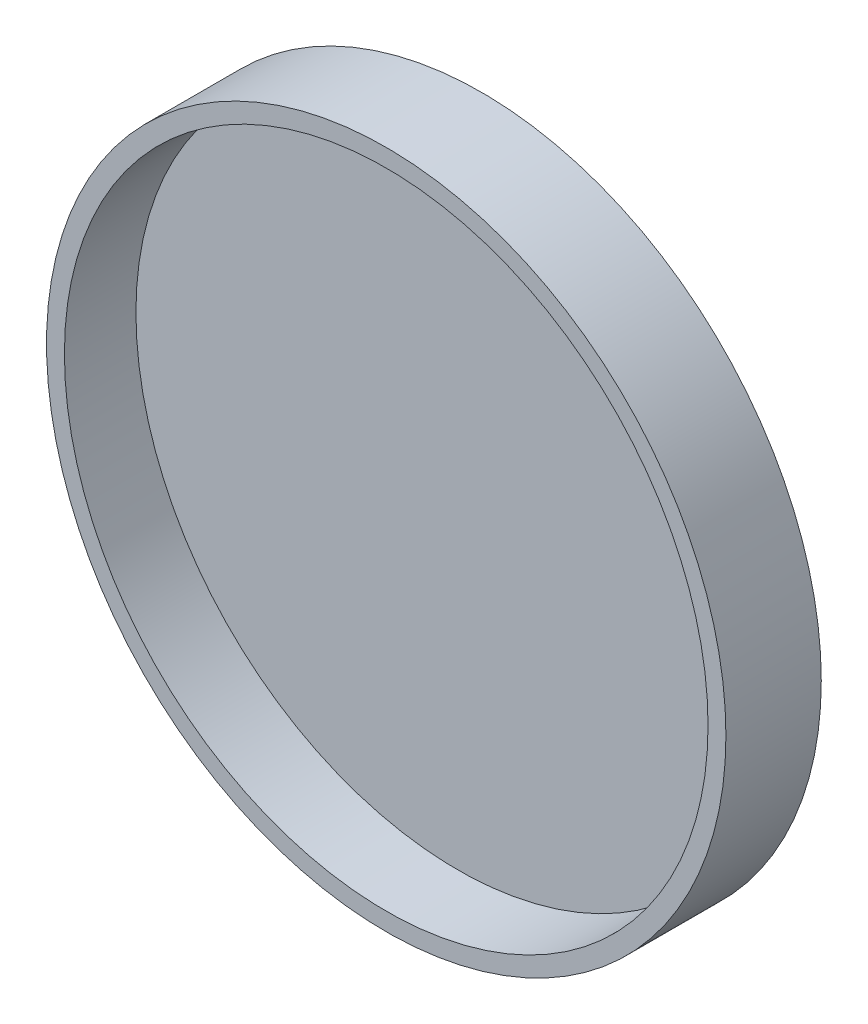
ISO-10303-21;
HEADER;
FILE_DESCRIPTION(('STEP AP214'),'2;1');
FILE_NAME('part.step','',(''),(''),'','','');
FILE_SCHEMA(('AUTOMOTIVE_DESIGN { 1 0 10303 214 1 1 1 1 }'));
ENDSEC;
DATA;
#1=APPLICATION_CONTEXT('core data for automotive mechanical design processes');
#2=APPLICATION_PROTOCOL_DEFINITION('international standard','automotive_design',2000,#1);
#3=PRODUCT_CONTEXT('',#1,'mechanical');
#4=PRODUCT('Part','Part','',(#3));
#5=PRODUCT_RELATED_PRODUCT_CATEGORY('part','',(#4));
#6=PRODUCT_DEFINITION_FORMATION('','',#4);
#7=PRODUCT_DEFINITION_CONTEXT('part definition',#1,'design');
#8=PRODUCT_DEFINITION('design','',#6,#7);
#9=PRODUCT_DEFINITION_SHAPE('','',#8);
#10=(LENGTH_UNIT() NAMED_UNIT(*) SI_UNIT(.MILLI.,.METRE.));
#11=(NAMED_UNIT(*) PLANE_ANGLE_UNIT() SI_UNIT($,.RADIAN.));
#12=(NAMED_UNIT(*) SI_UNIT($,.STERADIAN.) SOLID_ANGLE_UNIT());
#13=UNCERTAINTY_MEASURE_WITH_UNIT(LENGTH_MEASURE(1.E-05),#10,'distance_accuracy_value','');
#14=(GEOMETRIC_REPRESENTATION_CONTEXT(3) GLOBAL_UNCERTAINTY_ASSIGNED_CONTEXT((#13)) GLOBAL_UNIT_ASSIGNED_CONTEXT((#10,
#11,#12)) REPRESENTATION_CONTEXT('',''));
#15=CARTESIAN_POINT('',(0.,0.,0.));
#16=DIRECTION('',(0.,0.,1.));
#17=DIRECTION('',(1.,0.,0.));
#18=AXIS2_PLACEMENT_3D('',#15,#16,#17);
#19=CARTESIAN_POINT('',(0.,0.,0.5));
#20=DIRECTION('',(0.,0.,-1.));
#21=DIRECTION('',(-1.,0.,0.));
#22=AXIS2_PLACEMENT_3D('',#19,#20,#21);
#23=CYLINDRICAL_SURFACE('',#22,6.5);
#24=CARTESIAN_POINT('',(0.,0.,0.5));
#25=DIRECTION('',(0.,0.,1.));
#26=DIRECTION('',(1.,0.,0.));
#27=AXIS2_PLACEMENT_3D('',#24,#25,#26);
#28=CIRCLE('',#27,6.5);
#29=CARTESIAN_POINT('',(6.5,0.,0.5));
#30=VERTEX_POINT('',#29);
#31=EDGE_CURVE('E37',#30,#30,#28,.T.);
#32=ORIENTED_EDGE('',*,*,#31,.F.);
#33=EDGE_LOOP('',(#32));
#34=FACE_BOUND('',#33,.T.);
#35=CARTESIAN_POINT('',(0.,0.,0.));
#36=DIRECTION('',(0.,0.,1.));
#37=DIRECTION('',(1.,0.,0.));
#38=AXIS2_PLACEMENT_3D('',#35,#36,#37);
#39=CIRCLE('',#38,6.5);
#40=CARTESIAN_POINT('',(6.5,0.,0.));
#41=VERTEX_POINT('',#40);
#42=EDGE_CURVE('E41',#41,#41,#39,.T.);
#43=ORIENTED_EDGE('',*,*,#42,.T.);
#44=EDGE_LOOP('',(#43));
#45=FACE_BOUND('',#44,.T.);
#46=ADVANCED_FACE('F31',(#34,#45),#23,.T.);
#47=CARTESIAN_POINT('',(0.,0.,0.));
#48=DIRECTION('',(0.,0.,1.));
#49=DIRECTION('',(1.,0.,0.));
#50=AXIS2_PLACEMENT_3D('',#47,#48,#49);
#51=PLANE('',#50);
#52=ORIENTED_EDGE('',*,*,#42,.F.);
#53=EDGE_LOOP('',(#52));
#54=FACE_BOUND('',#53,.T.);
#55=ADVANCED_FACE('F87',(#54),#51,.F.);
#56=CARTESIAN_POINT('',(0.,0.,3.));
#57=DIRECTION('',(0.,0.,-1.));
#58=DIRECTION('',(-1.,0.,0.));
#59=AXIS2_PLACEMENT_3D('',#56,#57,#58);
#60=CYLINDRICAL_SURFACE('',#59,7.75);
#61=CARTESIAN_POINT('',(0.,0.,3.));
#62=DIRECTION('',(0.,0.,1.));
#63=DIRECTION('',(1.,0.,0.));
#64=AXIS2_PLACEMENT_3D('',#61,#62,#63);
#65=CIRCLE('',#64,7.75);
#66=CARTESIAN_POINT('',(7.75,0.,3.));
#67=VERTEX_POINT('',#66);
#68=EDGE_CURVE('E46',#67,#67,#65,.T.);
#69=ORIENTED_EDGE('',*,*,#68,.F.);
#70=EDGE_LOOP('',(#69));
#71=FACE_BOUND('',#70,.T.);
#72=CARTESIAN_POINT('',(0.,0.,0.5));
#73=DIRECTION('',(0.,0.,1.));
#74=DIRECTION('',(1.,0.,0.));
#75=AXIS2_PLACEMENT_3D('',#72,#73,#74);
#76=CIRCLE('',#75,7.75);
#77=CARTESIAN_POINT('',(7.75,0.,0.5));
#78=VERTEX_POINT('',#77);
#79=EDGE_CURVE('E48',#78,#78,#76,.T.);
#80=ORIENTED_EDGE('',*,*,#79,.T.);
#81=EDGE_LOOP('',(#80));
#82=FACE_BOUND('',#81,.T.);
#83=ADVANCED_FACE('F92',(#71,#82),#60,.T.);
#84=CARTESIAN_POINT('',(0.,0.,0.5));
#85=DIRECTION('',(0.,0.,1.));
#86=DIRECTION('',(1.,0.,0.));
#87=AXIS2_PLACEMENT_3D('',#84,#85,#86);
#88=PLANE('',#87);
#89=ORIENTED_EDGE('',*,*,#31,.T.);
#90=EDGE_LOOP('',(#89));
#91=FACE_BOUND('',#90,.T.);
#92=ORIENTED_EDGE('',*,*,#79,.F.);
#93=EDGE_LOOP('',(#92));
#94=FACE_BOUND('',#93,.T.);
#95=ADVANCED_FACE('F99',(#91,#94),#88,.F.);
#96=CARTESIAN_POINT('',(0.,0.,5.));
#97=DIRECTION('',(0.,0.,-1.));
#98=DIRECTION('',(-1.,0.,0.));
#99=AXIS2_PLACEMENT_3D('',#96,#97,#98);
#100=CYLINDRICAL_SURFACE('',#99,9.);
#101=CARTESIAN_POINT('',(0.,0.,5.));
#102=DIRECTION('',(0.,0.,1.));
#103=DIRECTION('',(1.,0.,0.));
#104=AXIS2_PLACEMENT_3D('',#101,#102,#103);
#105=CIRCLE('',#104,9.);
#106=CARTESIAN_POINT('',(9.,0.,5.));
#107=VERTEX_POINT('',#106);
#108=EDGE_CURVE('E51',#107,#107,#105,.T.);
#109=ORIENTED_EDGE('',*,*,#108,.F.);
#110=EDGE_LOOP('',(#109));
#111=FACE_BOUND('',#110,.T.);
#112=CARTESIAN_POINT('',(0.,0.,3.));
#113=DIRECTION('',(0.,0.,1.));
#114=DIRECTION('',(1.,0.,0.));
#115=AXIS2_PLACEMENT_3D('',#112,#113,#114);
#116=CIRCLE('',#115,9.);
#117=CARTESIAN_POINT('',(9.,0.,3.));
#118=VERTEX_POINT('',#117);
#119=EDGE_CURVE('E54',#118,#118,#116,.T.);
#120=ORIENTED_EDGE('',*,*,#119,.T.);
#121=EDGE_LOOP('',(#120));
#122=FACE_BOUND('',#121,.T.);
#123=ADVANCED_FACE('F105',(#111,#122),#100,.T.);
#124=CARTESIAN_POINT('',(0.,0.,3.));
#125=DIRECTION('',(0.,0.,1.));
#126=DIRECTION('',(1.,0.,0.));
#127=AXIS2_PLACEMENT_3D('',#124,#125,#126);
#128=PLANE('',#127);
#129=ORIENTED_EDGE('',*,*,#68,.T.);
#130=EDGE_LOOP('',(#129));
#131=FACE_BOUND('',#130,.T.);
#132=ORIENTED_EDGE('',*,*,#119,.F.);
#133=EDGE_LOOP('',(#132));
#134=FACE_BOUND('',#133,.T.);
#135=ADVANCED_FACE('F108',(#131,#134),#128,.F.);
#136=CARTESIAN_POINT('',(0.,0.,6.));
#137=DIRECTION('',(0.,0.,-1.));
#138=DIRECTION('',(-1.,0.,0.));
#139=AXIS2_PLACEMENT_3D('',#136,#137,#138);
#140=CYLINDRICAL_SURFACE('',#139,14.25);
#141=CARTESIAN_POINT('',(0.,0.,5.));
#142=DIRECTION('',(0.,0.,1.));
#143=DIRECTION('',(1.,0.,0.));
#144=AXIS2_PLACEMENT_3D('',#141,#142,#143);
#145=CIRCLE('',#144,14.25);
#146=CARTESIAN_POINT('',(14.25,0.,5.));
#147=VERTEX_POINT('',#146);
#148=EDGE_CURVE('E57',#147,#147,#145,.T.);
#149=ORIENTED_EDGE('',*,*,#148,.T.);
#150=EDGE_LOOP('',(#149));
#151=FACE_BOUND('',#150,.T.);
#152=CARTESIAN_POINT('',(0.,0.,9.));
#153=DIRECTION('',(0.,0.,1.));
#154=DIRECTION('',(1.,0.,0.));
#155=AXIS2_PLACEMENT_3D('',#152,#153,#154);
#156=CIRCLE('',#155,14.25);
#157=CARTESIAN_POINT('',(14.25,0.,9.));
#158=VERTEX_POINT('',#157);
#159=EDGE_CURVE('E62',#158,#158,#156,.T.);
#160=ORIENTED_EDGE('',*,*,#159,.F.);
#161=EDGE_LOOP('',(#160));
#162=FACE_BOUND('',#161,.T.);
#163=ADVANCED_FACE('F82',(#151,#162),#140,.T.);
#164=CARTESIAN_POINT('',(0.,0.,5.));
#165=DIRECTION('',(0.,0.,1.));
#166=DIRECTION('',(1.,0.,0.));
#167=AXIS2_PLACEMENT_3D('',#164,#165,#166);
#168=PLANE('',#167);
#169=ORIENTED_EDGE('',*,*,#108,.T.);
#170=EDGE_LOOP('',(#169));
#171=FACE_BOUND('',#170,.T.);
#172=ORIENTED_EDGE('',*,*,#148,.F.);
#173=EDGE_LOOP('',(#172));
#174=FACE_BOUND('',#173,.T.);
#175=ADVANCED_FACE('F73',(#171,#174),#168,.F.);
#176=CARTESIAN_POINT('',(0.,0.,9.));
#177=DIRECTION('',(0.,0.,1.));
#178=DIRECTION('',(1.,0.,0.));
#179=AXIS2_PLACEMENT_3D('',#176,#177,#178);
#180=PLANE('',#179);
#181=ORIENTED_EDGE('',*,*,#159,.T.);
#182=EDGE_LOOP('',(#181));
#183=FACE_BOUND('',#182,.T.);
#184=CARTESIAN_POINT('',(0.,0.,9.));
#185=DIRECTION('',(0.,0.,1.));
#186=DIRECTION('',(1.,0.,0.));
#187=AXIS2_PLACEMENT_3D('',#184,#185,#186);
#188=CIRCLE('',#187,13.5);
#189=CARTESIAN_POINT('',(13.5,0.,9.));
#190=VERTEX_POINT('',#189);
#191=EDGE_CURVE('E65',#190,#190,#188,.T.);
#192=ORIENTED_EDGE('',*,*,#191,.F.);
#193=EDGE_LOOP('',(#192));
#194=FACE_BOUND('',#193,.T.);
#195=ADVANCED_FACE('F71',(#183,#194),#180,.T.);
#196=CARTESIAN_POINT('',(0.,0.,9.));
#197=DIRECTION('',(0.,0.,-1.));
#198=DIRECTION('',(-1.,0.,0.));
#199=AXIS2_PLACEMENT_3D('',#196,#197,#198);
#200=CYLINDRICAL_SURFACE('',#199,13.5);
#201=ORIENTED_EDGE('',*,*,#191,.T.);
#202=EDGE_LOOP('',(#201));
#203=FACE_BOUND('',#202,.T.);
#204=CARTESIAN_POINT('',(0.,0.,6.));
#205=DIRECTION('',(0.,0.,1.));
#206=DIRECTION('',(1.,0.,0.));
#207=AXIS2_PLACEMENT_3D('',#204,#205,#206);
#208=CIRCLE('',#207,13.5);
#209=CARTESIAN_POINT('',(13.5,0.,6.));
#210=VERTEX_POINT('',#209);
#211=EDGE_CURVE('E10',#210,#210,#208,.F.);
#212=ORIENTED_EDGE('',*,*,#211,.T.);
#213=EDGE_LOOP('',(#212));
#214=FACE_BOUND('',#213,.T.);
#215=ADVANCED_FACE('F69',(#203,#214),#200,.F.);
#216=CARTESIAN_POINT('',(0.,0.,6.));
#217=DIRECTION('',(0.,0.,1.));
#218=DIRECTION('',(1.,0.,0.));
#219=AXIS2_PLACEMENT_3D('',#216,#217,#218);
#220=PLANE('',#219);
#221=ORIENTED_EDGE('',*,*,#211,.F.);
#222=EDGE_LOOP('',(#221));
#223=FACE_BOUND('',#222,.T.);
#224=ADVANCED_FACE('F80',(#223),#220,.T.);
#225=CLOSED_SHELL('',(#46,#55,#83,#95,#123,#135,#163,#175,#195,#215,#224));
#226=MANIFOLD_SOLID_BREP('B2',#225);
#227=ADVANCED_BREP_SHAPE_REPRESENTATION('',(#18,#226),#14);
#228=SHAPE_DEFINITION_REPRESENTATION(#9,#227);
ENDSEC;
END-ISO-10303-21;
